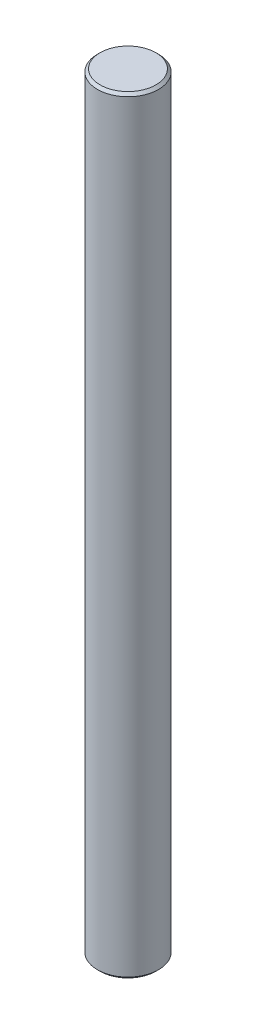
ISO-10303-21;
HEADER;
FILE_DESCRIPTION(('STEP AP214'),'2;1');
FILE_NAME('part.step','',(''),(''),'','','');
FILE_SCHEMA(('AUTOMOTIVE_DESIGN { 1 0 10303 214 1 1 1 1 }'));
ENDSEC;
DATA;
#1=APPLICATION_CONTEXT('core data for automotive mechanical design processes');
#2=APPLICATION_PROTOCOL_DEFINITION('international standard','automotive_design',2000,#1);
#3=PRODUCT_CONTEXT('',#1,'mechanical');
#4=PRODUCT('Part','Part','',(#3));
#5=PRODUCT_RELATED_PRODUCT_CATEGORY('part','',(#4));
#6=PRODUCT_DEFINITION_FORMATION('','',#4);
#7=PRODUCT_DEFINITION_CONTEXT('part definition',#1,'design');
#8=PRODUCT_DEFINITION('design','',#6,#7);
#9=PRODUCT_DEFINITION_SHAPE('','',#8);
#10=(LENGTH_UNIT() NAMED_UNIT(*) SI_UNIT(.MILLI.,.METRE.));
#11=(NAMED_UNIT(*) PLANE_ANGLE_UNIT() SI_UNIT($,.RADIAN.));
#12=(NAMED_UNIT(*) SI_UNIT($,.STERADIAN.) SOLID_ANGLE_UNIT());
#13=UNCERTAINTY_MEASURE_WITH_UNIT(LENGTH_MEASURE(1.E-05),#10,'distance_accuracy_value','');
#14=(GEOMETRIC_REPRESENTATION_CONTEXT(3) GLOBAL_UNCERTAINTY_ASSIGNED_CONTEXT((#13)) GLOBAL_UNIT_ASSIGNED_CONTEXT((#10,
#11,#12)) REPRESENTATION_CONTEXT('',''));
#15=CARTESIAN_POINT('',(0.,0.,0.));
#16=DIRECTION('',(0.,0.,1.));
#17=DIRECTION('',(1.,0.,0.));
#18=AXIS2_PLACEMENT_3D('',#15,#16,#17);
#19=CARTESIAN_POINT('',(17.4999999999999,440.,0.));
#20=DIRECTION('',(0.,-1.,0.));
#21=DIRECTION('',(1.,0.,0.));
#22=AXIS2_PLACEMENT_3D('',#19,#20,#21);
#23=PLANE('',#22);
#24=CARTESIAN_POINT('',(0.,440.,0.));
#25=DIRECTION('',(0.,-1.,0.));
#26=DIRECTION('',(1.,0.,0.));
#27=AXIS2_PLACEMENT_3D('',#24,#25,#26);
#28=CIRCLE('',#27,16.);
#29=CARTESIAN_POINT('',(16.,440.,0.));
#30=VERTEX_POINT('',#29);
#31=EDGE_CURVE('E10',#30,#30,#28,.F.);
#32=ORIENTED_EDGE('',*,*,#31,.T.);
#33=EDGE_LOOP('',(#32));
#34=FACE_BOUND('',#33,.T.);
#35=ADVANCED_FACE('F31',(#34),#23,.F.);
#36=CARTESIAN_POINT('',(0.,440.,0.));
#37=DIRECTION('',(0.,1.,0.));
#38=DIRECTION('',(-1.,0.,0.));
#39=AXIS2_PLACEMENT_3D('',#36,#37,#38);
#40=CYLINDRICAL_SURFACE('',#39,17.5);
#41=CARTESIAN_POINT('',(0.,1.49999999999989,0.));
#42=DIRECTION('',(0.,1.,0.));
#43=DIRECTION('',(-1.,0.,0.));
#44=AXIS2_PLACEMENT_3D('',#41,#42,#43);
#45=CIRCLE('',#44,17.5);
#46=CARTESIAN_POINT('',(-17.5,1.49999999999989,0.));
#47=VERTEX_POINT('',#46);
#48=EDGE_CURVE('E42',#47,#47,#45,.T.);
#49=ORIENTED_EDGE('',*,*,#48,.T.);
#50=EDGE_LOOP('',(#49));
#51=FACE_BOUND('',#50,.T.);
#52=CARTESIAN_POINT('',(0.,438.5,0.));
#53=DIRECTION('',(0.,-1.,0.));
#54=DIRECTION('',(1.,0.,0.));
#55=AXIS2_PLACEMENT_3D('',#52,#53,#54);
#56=CIRCLE('',#55,17.5);
#57=CARTESIAN_POINT('',(17.5,438.5,0.));
#58=VERTEX_POINT('',#57);
#59=EDGE_CURVE('E46',#58,#58,#56,.T.);
#60=ORIENTED_EDGE('',*,*,#59,.T.);
#61=EDGE_LOOP('',(#60));
#62=FACE_BOUND('',#61,.T.);
#63=ADVANCED_FACE('F69',(#51,#62),#40,.T.);
#64=CARTESIAN_POINT('',(17.5,0.,0.));
#65=DIRECTION('',(0.,1.,0.));
#66=DIRECTION('',(-1.,0.,0.));
#67=AXIS2_PLACEMENT_3D('',#64,#65,#66);
#68=PLANE('',#67);
#69=CARTESIAN_POINT('',(0.,0.,0.));
#70=DIRECTION('',(0.,-1.,0.));
#71=DIRECTION('',(1.,0.,0.));
#72=AXIS2_PLACEMENT_3D('',#69,#70,#71);
#73=CIRCLE('',#72,0.5);
#74=CARTESIAN_POINT('',(0.5,0.,0.));
#75=VERTEX_POINT('',#74);
#76=EDGE_CURVE('E52',#75,#75,#73,.T.);
#77=ORIENTED_EDGE('',*,*,#76,.F.);
#78=EDGE_LOOP('',(#77));
#79=FACE_BOUND('',#78,.T.);
#80=CARTESIAN_POINT('',(0.,0.,0.));
#81=DIRECTION('',(0.,1.,0.));
#82=DIRECTION('',(-1.,0.,0.));
#83=AXIS2_PLACEMENT_3D('',#80,#81,#82);
#84=CIRCLE('',#83,16.0000000000001);
#85=CARTESIAN_POINT('',(-16.0000000000001,0.,0.));
#86=VERTEX_POINT('',#85);
#87=EDGE_CURVE('E38',#86,#86,#84,.F.);
#88=ORIENTED_EDGE('',*,*,#87,.T.);
#89=EDGE_LOOP('',(#88));
#90=FACE_BOUND('',#89,.T.);
#91=ADVANCED_FACE('F66',(#79,#90),#68,.F.);
#92=CARTESIAN_POINT('',(0.,1.49999999999989,0.));
#93=DIRECTION('',(0.,1.,0.));
#94=DIRECTION('',(-1.,0.,0.));
#95=AXIS2_PLACEMENT_3D('',#92,#93,#94);
#96=CONICAL_SURFACE('',#95,17.5,0.785398163397443);
#97=ORIENTED_EDGE('',*,*,#87,.F.);
#98=EDGE_LOOP('',(#97));
#99=FACE_BOUND('',#98,.T.);
#100=ORIENTED_EDGE('',*,*,#48,.F.);
#101=EDGE_LOOP('',(#100));
#102=FACE_BOUND('',#101,.T.);
#103=ADVANCED_FACE('F68',(#99,#102),#96,.T.);
#104=CARTESIAN_POINT('',(0.,440.,0.));
#105=DIRECTION('',(0.,-1.,0.));
#106=DIRECTION('',(1.,0.,0.));
#107=AXIS2_PLACEMENT_3D('',#104,#105,#106);
#108=CONICAL_SURFACE('',#107,16.,0.785398163397443);
#109=ORIENTED_EDGE('',*,*,#59,.F.);
#110=EDGE_LOOP('',(#109));
#111=FACE_BOUND('',#110,.T.);
#112=ORIENTED_EDGE('',*,*,#31,.F.);
#113=EDGE_LOOP('',(#112));
#114=FACE_BOUND('',#113,.T.);
#115=ADVANCED_FACE('F33',(#111,#114),#108,.T.);
#116=CARTESIAN_POINT('',(0.,3.,0.));
#117=DIRECTION('',(0.,-1.,0.));
#118=DIRECTION('',(1.,0.,0.));
#119=AXIS2_PLACEMENT_3D('',#116,#117,#118);
#120=CYLINDRICAL_SURFACE('',#119,0.5);
#121=CARTESIAN_POINT('',(0.,3.,0.));
#122=DIRECTION('',(0.,-1.,0.));
#123=DIRECTION('',(1.,0.,0.));
#124=AXIS2_PLACEMENT_3D('',#121,#122,#123);
#125=CIRCLE('',#124,0.5);
#126=CARTESIAN_POINT('',(0.5,3.,0.));
#127=VERTEX_POINT('',#126);
#128=EDGE_CURVE('E51',#127,#127,#125,.T.);
#129=ORIENTED_EDGE('',*,*,#128,.F.);
#130=EDGE_LOOP('',(#129));
#131=FACE_BOUND('',#130,.T.);
#132=ORIENTED_EDGE('',*,*,#76,.T.);
#133=EDGE_LOOP('',(#132));
#134=FACE_BOUND('',#133,.T.);
#135=ADVANCED_FACE('F60',(#131,#134),#120,.F.);
#136=CARTESIAN_POINT('',(0.,3.,0.));
#137=DIRECTION('',(0.,-1.,0.));
#138=DIRECTION('',(1.,0.,0.));
#139=AXIS2_PLACEMENT_3D('',#136,#137,#138);
#140=PLANE('',#139);
#141=ORIENTED_EDGE('',*,*,#128,.T.);
#142=EDGE_LOOP('',(#141));
#143=FACE_BOUND('',#142,.T.);
#144=ADVANCED_FACE('F58',(#143),#140,.T.);
#145=CLOSED_SHELL('',(#35,#63,#91,#103,#115,#135,#144));
#146=MANIFOLD_SOLID_BREP('B2',#145);
#147=ADVANCED_BREP_SHAPE_REPRESENTATION('',(#18,#146),#14);
#148=SHAPE_DEFINITION_REPRESENTATION(#9,#147);
ENDSEC;
END-ISO-10303-21;
